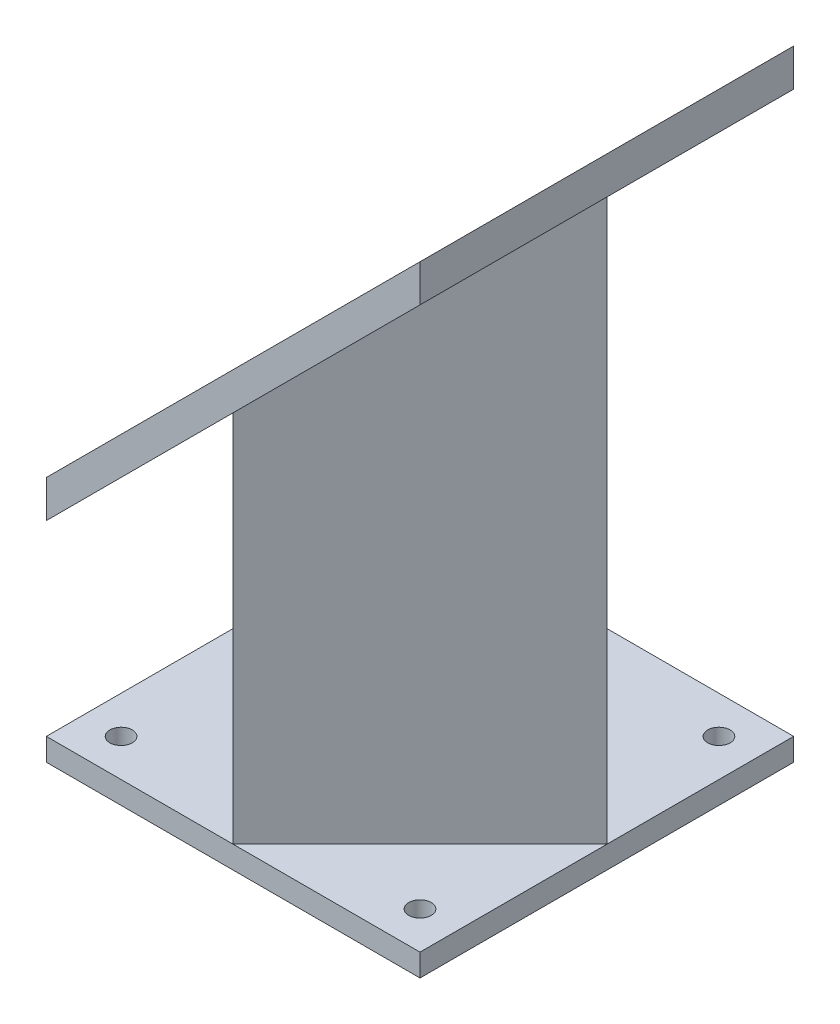
ISO-10303-21;
HEADER;
FILE_DESCRIPTION(('STEP AP214'),'2;1');
FILE_NAME('part.step','',(''),(''),'','','');
FILE_SCHEMA(('AUTOMOTIVE_DESIGN { 1 0 10303 214 1 1 1 1 }'));
ENDSEC;
DATA;
#1=APPLICATION_CONTEXT('core data for automotive mechanical design processes');
#2=APPLICATION_PROTOCOL_DEFINITION('international standard','automotive_design',2000,#1);
#3=PRODUCT_CONTEXT('',#1,'mechanical');
#4=PRODUCT('Part','Part','',(#3));
#5=PRODUCT_RELATED_PRODUCT_CATEGORY('part','',(#4));
#6=PRODUCT_DEFINITION_FORMATION('','',#4);
#7=PRODUCT_DEFINITION_CONTEXT('part definition',#1,'design');
#8=PRODUCT_DEFINITION('design','',#6,#7);
#9=PRODUCT_DEFINITION_SHAPE('','',#8);
#10=(LENGTH_UNIT() NAMED_UNIT(*) SI_UNIT(.MILLI.,.METRE.));
#11=(NAMED_UNIT(*) PLANE_ANGLE_UNIT() SI_UNIT($,.RADIAN.));
#12=(NAMED_UNIT(*) SI_UNIT($,.STERADIAN.) SOLID_ANGLE_UNIT());
#13=UNCERTAINTY_MEASURE_WITH_UNIT(LENGTH_MEASURE(1.E-05),#10,'distance_accuracy_value','');
#14=(GEOMETRIC_REPRESENTATION_CONTEXT(3) GLOBAL_UNCERTAINTY_ASSIGNED_CONTEXT((#13)) GLOBAL_UNIT_ASSIGNED_CONTEXT((#10,
#11,#12)) REPRESENTATION_CONTEXT('',''));
#15=CARTESIAN_POINT('',(0.,0.,0.));
#16=DIRECTION('',(0.,0.,1.));
#17=DIRECTION('',(1.,0.,0.));
#18=AXIS2_PLACEMENT_3D('',#15,#16,#17);
#19=CARTESIAN_POINT('',(0.,3.,0.));
#20=DIRECTION('',(0.,-1.,0.));
#21=DIRECTION('',(0.,0.,-1.));
#22=AXIS2_PLACEMENT_3D('',#19,#20,#21);
#23=PLANE('',#22);
#24=CARTESIAN_POINT('',(20.,3.,-20.));
#25=DIRECTION('',(0.,1.,0.));
#26=DIRECTION('',(0.,0.,1.));
#27=AXIS2_PLACEMENT_3D('',#24,#25,#26);
#28=CIRCLE('',#27,1.5);
#29=CARTESIAN_POINT('',(20.,3.,-18.5));
#30=VERTEX_POINT('',#29);
#31=EDGE_CURVE('E266',#30,#30,#28,.T.);
#32=ORIENTED_EDGE('',*,*,#31,.F.);
#33=EDGE_LOOP('',(#32));
#34=FACE_BOUND('',#33,.T.);
#35=DIRECTION('',(-0.707106781186547,0.,-0.707106781186547));
#36=VECTOR('',#35,1.);
#37=CARTESIAN_POINT('',(25.,3.,0.));
#38=LINE('',#37,#36);
#39=CARTESIAN_POINT('',(25.,3.,0.));
#40=VERTEX_POINT('',#39);
#41=CARTESIAN_POINT('',(0.,3.,-25.));
#42=VERTEX_POINT('',#41);
#43=EDGE_CURVE('E238',#40,#42,#38,.T.);
#44=ORIENTED_EDGE('',*,*,#43,.F.);
#45=DIRECTION('',(0.,0.,-1.));
#46=VECTOR('',#45,1.);
#47=CARTESIAN_POINT('',(25.,3.,25.));
#48=LINE('',#47,#46);
#49=CARTESIAN_POINT('',(25.,3.,-25.));
#50=VERTEX_POINT('',#49);
#51=EDGE_CURVE('E288',#40,#50,#48,.T.);
#52=ORIENTED_EDGE('',*,*,#51,.T.);
#53=DIRECTION('',(-1.,0.,0.));
#54=VECTOR('',#53,1.);
#55=CARTESIAN_POINT('',(-25.,3.,-25.));
#56=LINE('',#55,#54);
#57=EDGE_CURVE('E289',#50,#42,#56,.T.);
#58=ORIENTED_EDGE('',*,*,#57,.T.);
#59=EDGE_LOOP('',(#44,#52,#58));
#60=FACE_BOUND('',#59,.T.);
#61=ADVANCED_FACE('F37',(#34,#60),#23,.F.);
#62=CARTESIAN_POINT('',(20.,3.,20.));
#63=DIRECTION('',(0.,1.,0.));
#64=DIRECTION('',(0.,0.,1.));
#65=AXIS2_PLACEMENT_3D('',#62,#63,#64);
#66=CIRCLE('',#65,1.5);
#67=CARTESIAN_POINT('',(20.,3.,21.5));
#68=VERTEX_POINT('',#67);
#69=EDGE_CURVE('E260',#68,#68,#66,.T.);
#70=ORIENTED_EDGE('',*,*,#69,.F.);
#71=EDGE_LOOP('',(#70));
#72=FACE_BOUND('',#71,.T.);
#73=DIRECTION('',(0.707106781186547,0.,-0.707106781186547));
#74=VECTOR('',#73,1.);
#75=CARTESIAN_POINT('',(0.,3.,25.));
#76=LINE('',#75,#74);
#77=CARTESIAN_POINT('',(0.,3.,25.));
#78=VERTEX_POINT('',#77);
#79=EDGE_CURVE('E247',#78,#40,#76,.T.);
#80=ORIENTED_EDGE('',*,*,#79,.F.);
#81=DIRECTION('',(1.,0.,0.));
#82=VECTOR('',#81,1.);
#83=CARTESIAN_POINT('',(-25.,3.,25.));
#84=LINE('',#83,#82);
#85=CARTESIAN_POINT('',(25.,3.,25.));
#86=VERTEX_POINT('',#85);
#87=EDGE_CURVE('E296',#78,#86,#84,.T.);
#88=ORIENTED_EDGE('',*,*,#87,.T.);
#89=EDGE_CURVE('E284',#86,#40,#48,.T.);
#90=ORIENTED_EDGE('',*,*,#89,.T.);
#91=EDGE_LOOP('',(#80,#88,#90));
#92=FACE_BOUND('',#91,.T.);
#93=ADVANCED_FACE('F339',(#72,#92),#23,.F.);
#94=CARTESIAN_POINT('',(-20.,3.,20.));
#95=DIRECTION('',(0.,1.,0.));
#96=DIRECTION('',(0.,0.,1.));
#97=AXIS2_PLACEMENT_3D('',#94,#95,#96);
#98=CIRCLE('',#97,1.5);
#99=CARTESIAN_POINT('',(-20.,3.,21.5));
#100=VERTEX_POINT('',#99);
#101=EDGE_CURVE('E278',#100,#100,#98,.T.);
#102=ORIENTED_EDGE('',*,*,#101,.F.);
#103=EDGE_LOOP('',(#102));
#104=FACE_BOUND('',#103,.T.);
#105=DIRECTION('',(0.707106781186548,0.,0.707106781186547));
#106=VECTOR('',#105,1.);
#107=CARTESIAN_POINT('',(-25.,3.,0.));
#108=LINE('',#107,#106);
#109=CARTESIAN_POINT('',(-25.,3.,0.));
#110=VERTEX_POINT('',#109);
#111=EDGE_CURVE('E244',#110,#78,#108,.T.);
#112=ORIENTED_EDGE('',*,*,#111,.F.);
#113=DIRECTION('',(0.,0.,1.));
#114=VECTOR('',#113,1.);
#115=CARTESIAN_POINT('',(-25.,3.,25.));
#116=LINE('',#115,#114);
#117=CARTESIAN_POINT('',(-25.,3.,25.));
#118=VERTEX_POINT('',#117);
#119=EDGE_CURVE('E292',#110,#118,#116,.T.);
#120=ORIENTED_EDGE('',*,*,#119,.T.);
#121=EDGE_CURVE('E297',#118,#78,#84,.T.);
#122=ORIENTED_EDGE('',*,*,#121,.T.);
#123=EDGE_LOOP('',(#112,#120,#122));
#124=FACE_BOUND('',#123,.T.);
#125=ADVANCED_FACE('F372',(#104,#124),#23,.F.);
#126=CARTESIAN_POINT('',(-20.,3.,-20.));
#127=DIRECTION('',(0.,1.,0.));
#128=DIRECTION('',(0.,0.,1.));
#129=AXIS2_PLACEMENT_3D('',#126,#127,#128);
#130=CIRCLE('',#129,1.5);
#131=CARTESIAN_POINT('',(-20.,3.,-18.5));
#132=VERTEX_POINT('',#131);
#133=EDGE_CURVE('E272',#132,#132,#130,.T.);
#134=ORIENTED_EDGE('',*,*,#133,.F.);
#135=EDGE_LOOP('',(#134));
#136=FACE_BOUND('',#135,.T.);
#137=DIRECTION('',(-0.707106781186548,0.,0.707106781186547));
#138=VECTOR('',#137,1.);
#139=CARTESIAN_POINT('',(0.,3.,-25.));
#140=LINE('',#139,#138);
#141=EDGE_CURVE('E241',#42,#110,#140,.T.);
#142=ORIENTED_EDGE('',*,*,#141,.F.);
#143=CARTESIAN_POINT('',(-25.,3.,-25.));
#144=VERTEX_POINT('',#143);
#145=EDGE_CURVE('E287',#42,#144,#56,.T.);
#146=ORIENTED_EDGE('',*,*,#145,.T.);
#147=EDGE_CURVE('E293',#144,#110,#116,.T.);
#148=ORIENTED_EDGE('',*,*,#147,.T.);
#149=EDGE_LOOP('',(#142,#146,#148));
#150=FACE_BOUND('',#149,.T.);
#151=ADVANCED_FACE('F370',(#136,#150),#23,.F.);
#152=CARTESIAN_POINT('',(0.,0.,0.));
#153=DIRECTION('',(0.,-1.,0.));
#154=DIRECTION('',(0.,0.,-1.));
#155=AXIS2_PLACEMENT_3D('',#152,#153,#154);
#156=PLANE('',#155);
#157=CARTESIAN_POINT('',(20.,0.,-20.));
#158=DIRECTION('',(0.,1.,0.));
#159=DIRECTION('',(0.,0.,1.));
#160=AXIS2_PLACEMENT_3D('',#157,#158,#159);
#161=CIRCLE('',#160,1.5);
#162=CARTESIAN_POINT('',(20.,0.,-18.5));
#163=VERTEX_POINT('',#162);
#164=EDGE_CURVE('E263',#163,#163,#161,.T.);
#165=ORIENTED_EDGE('',*,*,#164,.T.);
#166=EDGE_LOOP('',(#165));
#167=FACE_BOUND('',#166,.T.);
#168=CARTESIAN_POINT('',(-20.,0.,20.));
#169=DIRECTION('',(0.,1.,0.));
#170=DIRECTION('',(0.,0.,1.));
#171=AXIS2_PLACEMENT_3D('',#168,#169,#170);
#172=CIRCLE('',#171,1.5);
#173=CARTESIAN_POINT('',(-20.,0.,21.5));
#174=VERTEX_POINT('',#173);
#175=EDGE_CURVE('E275',#174,#174,#172,.T.);
#176=ORIENTED_EDGE('',*,*,#175,.T.);
#177=EDGE_LOOP('',(#176));
#178=FACE_BOUND('',#177,.T.);
#179=DIRECTION('',(0.,0.,-1.));
#180=VECTOR('',#179,1.);
#181=CARTESIAN_POINT('',(25.,0.,25.));
#182=LINE('',#181,#180);
#183=CARTESIAN_POINT('',(25.,0.,25.));
#184=VERTEX_POINT('',#183);
#185=CARTESIAN_POINT('',(25.,0.,-25.));
#186=VERTEX_POINT('',#185);
#187=EDGE_CURVE('E281',#184,#186,#182,.T.);
#188=ORIENTED_EDGE('',*,*,#187,.F.);
#189=DIRECTION('',(1.,0.,0.));
#190=VECTOR('',#189,1.);
#191=CARTESIAN_POINT('',(-25.,0.,25.));
#192=LINE('',#191,#190);
#193=CARTESIAN_POINT('',(-25.,0.,25.));
#194=VERTEX_POINT('',#193);
#195=EDGE_CURVE('E307',#194,#184,#192,.T.);
#196=ORIENTED_EDGE('',*,*,#195,.F.);
#197=DIRECTION('',(0.,0.,1.));
#198=VECTOR('',#197,1.);
#199=CARTESIAN_POINT('',(-25.,0.,25.));
#200=LINE('',#199,#198);
#201=CARTESIAN_POINT('',(-25.,0.,-25.));
#202=VERTEX_POINT('',#201);
#203=EDGE_CURVE('E305',#202,#194,#200,.T.);
#204=ORIENTED_EDGE('',*,*,#203,.F.);
#205=DIRECTION('',(-1.,0.,0.));
#206=VECTOR('',#205,1.);
#207=CARTESIAN_POINT('',(-25.,0.,-25.));
#208=LINE('',#207,#206);
#209=EDGE_CURVE('E303',#186,#202,#208,.T.);
#210=ORIENTED_EDGE('',*,*,#209,.F.);
#211=EDGE_LOOP('',(#188,#196,#204,#210));
#212=FACE_BOUND('',#211,.T.);
#213=CARTESIAN_POINT('',(-20.,0.,-20.));
#214=DIRECTION('',(0.,1.,0.));
#215=DIRECTION('',(0.,0.,1.));
#216=AXIS2_PLACEMENT_3D('',#213,#214,#215);
#217=CIRCLE('',#216,1.5);
#218=CARTESIAN_POINT('',(-20.,0.,-18.5));
#219=VERTEX_POINT('',#218);
#220=EDGE_CURVE('E269',#219,#219,#217,.T.);
#221=ORIENTED_EDGE('',*,*,#220,.T.);
#222=EDGE_LOOP('',(#221));
#223=FACE_BOUND('',#222,.T.);
#224=CARTESIAN_POINT('',(20.,0.,20.));
#225=DIRECTION('',(0.,1.,0.));
#226=DIRECTION('',(0.,0.,1.));
#227=AXIS2_PLACEMENT_3D('',#224,#225,#226);
#228=CIRCLE('',#227,1.5);
#229=CARTESIAN_POINT('',(20.,0.,21.5));
#230=VERTEX_POINT('',#229);
#231=EDGE_CURVE('E259',#230,#230,#228,.T.);
#232=ORIENTED_EDGE('',*,*,#231,.T.);
#233=EDGE_LOOP('',(#232));
#234=FACE_BOUND('',#233,.T.);
#235=ADVANCED_FACE('F326',(#167,#178,#212,#223,#234),#156,.T.);
#236=CARTESIAN_POINT('',(25.,3.,25.));
#237=DIRECTION('',(-1.,0.,0.));
#238=DIRECTION('',(0.,0.,1.));
#239=AXIS2_PLACEMENT_3D('',#236,#237,#238);
#240=PLANE('',#239);
#241=ORIENTED_EDGE('',*,*,#187,.T.);
#242=DIRECTION('',(0.,-1.,0.));
#243=VECTOR('',#242,1.);
#244=CARTESIAN_POINT('',(25.,3.,-25.));
#245=LINE('',#244,#243);
#246=EDGE_CURVE('E11',#50,#186,#245,.T.);
#247=ORIENTED_EDGE('',*,*,#246,.F.);
#248=ORIENTED_EDGE('',*,*,#51,.F.);
#249=ORIENTED_EDGE('',*,*,#89,.F.);
#250=DIRECTION('',(0.,-1.,0.));
#251=VECTOR('',#250,1.);
#252=CARTESIAN_POINT('',(25.,3.,25.));
#253=LINE('',#252,#251);
#254=EDGE_CURVE('E300',#86,#184,#253,.T.);
#255=ORIENTED_EDGE('',*,*,#254,.T.);
#256=EDGE_LOOP('',(#241,#247,#248,#249,#255));
#257=FACE_BOUND('',#256,.T.);
#258=ADVANCED_FACE('F39',(#257),#240,.F.);
#259=CARTESIAN_POINT('',(-25.,3.,-25.));
#260=DIRECTION('',(0.,0.,1.));
#261=DIRECTION('',(1.,0.,0.));
#262=AXIS2_PLACEMENT_3D('',#259,#260,#261);
#263=PLANE('',#262);
#264=ORIENTED_EDGE('',*,*,#209,.T.);
#265=DIRECTION('',(0.,-1.,0.));
#266=VECTOR('',#265,1.);
#267=CARTESIAN_POINT('',(-25.,3.,-25.));
#268=LINE('',#267,#266);
#269=EDGE_CURVE('E45',#144,#202,#268,.T.);
#270=ORIENTED_EDGE('',*,*,#269,.F.);
#271=ORIENTED_EDGE('',*,*,#145,.F.);
#272=ORIENTED_EDGE('',*,*,#57,.F.);
#273=ORIENTED_EDGE('',*,*,#246,.T.);
#274=EDGE_LOOP('',(#264,#270,#271,#272,#273));
#275=FACE_BOUND('',#274,.T.);
#276=ADVANCED_FACE('F451',(#275),#263,.F.);
#277=CARTESIAN_POINT('',(-25.,3.,25.));
#278=DIRECTION('',(1.,0.,0.));
#279=DIRECTION('',(0.,0.,-1.));
#280=AXIS2_PLACEMENT_3D('',#277,#278,#279);
#281=PLANE('',#280);
#282=ORIENTED_EDGE('',*,*,#203,.T.);
#283=DIRECTION('',(0.,-1.,0.));
#284=VECTOR('',#283,1.);
#285=CARTESIAN_POINT('',(-25.,3.,25.));
#286=LINE('',#285,#284);
#287=EDGE_CURVE('E311',#118,#194,#286,.T.);
#288=ORIENTED_EDGE('',*,*,#287,.F.);
#289=ORIENTED_EDGE('',*,*,#119,.F.);
#290=ORIENTED_EDGE('',*,*,#147,.F.);
#291=ORIENTED_EDGE('',*,*,#269,.T.);
#292=EDGE_LOOP('',(#282,#288,#289,#290,#291));
#293=FACE_BOUND('',#292,.T.);
#294=ADVANCED_FACE('F318',(#293),#281,.F.);
#295=CARTESIAN_POINT('',(-25.,3.,25.));
#296=DIRECTION('',(0.,0.,-1.));
#297=DIRECTION('',(-1.,0.,0.));
#298=AXIS2_PLACEMENT_3D('',#295,#296,#297);
#299=PLANE('',#298);
#300=ORIENTED_EDGE('',*,*,#195,.T.);
#301=ORIENTED_EDGE('',*,*,#254,.F.);
#302=ORIENTED_EDGE('',*,*,#87,.F.);
#303=ORIENTED_EDGE('',*,*,#121,.F.);
#304=ORIENTED_EDGE('',*,*,#287,.T.);
#305=EDGE_LOOP('',(#300,#301,#302,#303,#304));
#306=FACE_BOUND('',#305,.T.);
#307=ADVANCED_FACE('F330',(#306),#299,.F.);
#308=CARTESIAN_POINT('',(-20.,3.,20.));
#309=DIRECTION('',(0.,-1.,0.));
#310=DIRECTION('',(0.,0.,-1.));
#311=AXIS2_PLACEMENT_3D('',#308,#309,#310);
#312=CYLINDRICAL_SURFACE('',#311,1.5);
#313=ORIENTED_EDGE('',*,*,#101,.T.);
#314=EDGE_LOOP('',(#313));
#315=FACE_BOUND('',#314,.T.);
#316=ORIENTED_EDGE('',*,*,#175,.F.);
#317=EDGE_LOOP('',(#316));
#318=FACE_BOUND('',#317,.T.);
#319=ADVANCED_FACE('F435',(#315,#318),#312,.F.);
#320=CARTESIAN_POINT('',(-20.,3.,-20.));
#321=DIRECTION('',(0.,-1.,0.));
#322=DIRECTION('',(0.,0.,-1.));
#323=AXIS2_PLACEMENT_3D('',#320,#321,#322);
#324=CYLINDRICAL_SURFACE('',#323,1.5);
#325=ORIENTED_EDGE('',*,*,#133,.T.);
#326=EDGE_LOOP('',(#325));
#327=FACE_BOUND('',#326,.T.);
#328=ORIENTED_EDGE('',*,*,#220,.F.);
#329=EDGE_LOOP('',(#328));
#330=FACE_BOUND('',#329,.T.);
#331=ADVANCED_FACE('F432',(#327,#330),#324,.F.);
#332=CARTESIAN_POINT('',(20.,3.,-20.));
#333=DIRECTION('',(0.,-1.,0.));
#334=DIRECTION('',(0.,0.,-1.));
#335=AXIS2_PLACEMENT_3D('',#332,#333,#334);
#336=CYLINDRICAL_SURFACE('',#335,1.5);
#337=ORIENTED_EDGE('',*,*,#31,.T.);
#338=EDGE_LOOP('',(#337));
#339=FACE_BOUND('',#338,.T.);
#340=ORIENTED_EDGE('',*,*,#164,.F.);
#341=EDGE_LOOP('',(#340));
#342=FACE_BOUND('',#341,.T.);
#343=ADVANCED_FACE('F428',(#339,#342),#336,.F.);
#344=CARTESIAN_POINT('',(20.,3.,20.));
#345=DIRECTION('',(0.,-1.,0.));
#346=DIRECTION('',(0.,0.,-1.));
#347=AXIS2_PLACEMENT_3D('',#344,#345,#346);
#348=CYLINDRICAL_SURFACE('',#347,1.5);
#349=ORIENTED_EDGE('',*,*,#69,.T.);
#350=EDGE_LOOP('',(#349));
#351=FACE_BOUND('',#350,.T.);
#352=ORIENTED_EDGE('',*,*,#231,.F.);
#353=EDGE_LOOP('',(#352));
#354=FACE_BOUND('',#353,.T.);
#355=ADVANCED_FACE('F425',(#351,#354),#348,.F.);
#356=CARTESIAN_POINT('',(25.,78.,0.));
#357=DIRECTION('',(-0.707106781186548,0.,0.707106781186548));
#358=DIRECTION('',(0.707106781186548,0.,0.707106781186548));
#359=AXIS2_PLACEMENT_3D('',#356,#357,#358);
#360=PLANE('',#359);
#361=DIRECTION('',(0.,-1.,0.));
#362=VECTOR('',#361,1.);
#363=CARTESIAN_POINT('',(0.,78.,-25.));
#364=LINE('',#363,#362);
#365=CARTESIAN_POINT('',(0.,53.0000000000002,-25.));
#366=VERTEX_POINT('',#365);
#367=EDGE_CURVE('E257',#366,#42,#364,.T.);
#368=ORIENTED_EDGE('',*,*,#367,.F.);
#369=DIRECTION('',(0.577350269189628,0.577350269189622,0.577350269189628));
#370=VECTOR('',#369,1.);
#371=CARTESIAN_POINT('',(25.,78.,0.));
#372=LINE('',#371,#370);
#373=CARTESIAN_POINT('',(25.,78.,0.));
#374=VERTEX_POINT('',#373);
#375=EDGE_CURVE('E223',#366,#374,#372,.T.);
#376=ORIENTED_EDGE('',*,*,#375,.T.);
#377=DIRECTION('',(0.,-1.,0.));
#378=VECTOR('',#377,1.);
#379=CARTESIAN_POINT('',(25.,78.,0.));
#380=LINE('',#379,#378);
#381=EDGE_CURVE('E250',#374,#40,#380,.T.);
#382=ORIENTED_EDGE('',*,*,#381,.T.);
#383=ORIENTED_EDGE('',*,*,#43,.T.);
#384=EDGE_LOOP('',(#368,#376,#382,#383));
#385=FACE_BOUND('',#384,.T.);
#386=ADVANCED_FACE('F346',(#385),#360,.F.);
#387=CARTESIAN_POINT('',(0.,78.,-25.));
#388=DIRECTION('',(0.707106781186547,0.,0.707106781186548));
#389=DIRECTION('',(0.707106781186548,0.,-0.707106781186547));
#390=AXIS2_PLACEMENT_3D('',#387,#388,#389);
#391=PLANE('',#390);
#392=DIRECTION('',(0.,-1.,0.));
#393=VECTOR('',#392,1.);
#394=CARTESIAN_POINT('',(-25.,78.,0.));
#395=LINE('',#394,#393);
#396=CARTESIAN_POINT('',(-25.,28.0000000000005,0.));
#397=VERTEX_POINT('',#396);
#398=EDGE_CURVE('E255',#397,#110,#395,.T.);
#399=ORIENTED_EDGE('',*,*,#398,.F.);
#400=DIRECTION('',(0.577350269189628,0.577350269189622,-0.577350269189628));
#401=VECTOR('',#400,1.);
#402=CARTESIAN_POINT('',(8.33333333333322,61.3333333333334,-33.3333333333332));
#403=LINE('',#402,#401);
#404=EDGE_CURVE('E220',#397,#366,#403,.T.);
#405=ORIENTED_EDGE('',*,*,#404,.T.);
#406=ORIENTED_EDGE('',*,*,#367,.T.);
#407=ORIENTED_EDGE('',*,*,#141,.T.);
#408=EDGE_LOOP('',(#399,#405,#406,#407));
#409=FACE_BOUND('',#408,.T.);
#410=ADVANCED_FACE('F363',(#409),#391,.F.);
#411=CARTESIAN_POINT('',(-25.,78.,0.));
#412=DIRECTION('',(0.707106781186547,0.,-0.707106781186548));
#413=DIRECTION('',(-0.707106781186548,0.,-0.707106781186547));
#414=AXIS2_PLACEMENT_3D('',#411,#412,#413);
#415=PLANE('',#414);
#416=DIRECTION('',(0.,-1.,0.));
#417=VECTOR('',#416,1.);
#418=CARTESIAN_POINT('',(0.,78.,25.));
#419=LINE('',#418,#417);
#420=CARTESIAN_POINT('',(0.,53.0000000000003,25.));
#421=VERTEX_POINT('',#420);
#422=EDGE_CURVE('E253',#421,#78,#419,.T.);
#423=ORIENTED_EDGE('',*,*,#422,.F.);
#424=DIRECTION('',(-0.577350269189628,-0.577350269189622,-0.577350269189628));
#425=VECTOR('',#424,1.);
#426=CARTESIAN_POINT('',(-8.33333333333356,44.6666666666668,16.6666666666664));
#427=LINE('',#426,#425);
#428=EDGE_CURVE('E217',#421,#397,#427,.T.);
#429=ORIENTED_EDGE('',*,*,#428,.T.);
#430=ORIENTED_EDGE('',*,*,#398,.T.);
#431=ORIENTED_EDGE('',*,*,#111,.T.);
#432=EDGE_LOOP('',(#423,#429,#430,#431));
#433=FACE_BOUND('',#432,.T.);
#434=ADVANCED_FACE('F366',(#433),#415,.F.);
#435=CARTESIAN_POINT('',(0.,78.,25.));
#436=DIRECTION('',(-0.707106781186548,0.,-0.707106781186548));
#437=DIRECTION('',(-0.707106781186548,0.,0.707106781186548));
#438=AXIS2_PLACEMENT_3D('',#435,#436,#437);
#439=PLANE('',#438);
#440=ORIENTED_EDGE('',*,*,#381,.F.);
#441=DIRECTION('',(-0.577350269189628,-0.577350269189622,0.577350269189628));
#442=VECTOR('',#441,1.);
#443=CARTESIAN_POINT('',(8.33333333333322,61.3333333333334,16.6666666666668));
#444=LINE('',#443,#442);
#445=EDGE_CURVE('E214',#374,#421,#444,.T.);
#446=ORIENTED_EDGE('',*,*,#445,.T.);
#447=ORIENTED_EDGE('',*,*,#422,.T.);
#448=ORIENTED_EDGE('',*,*,#79,.T.);
#449=EDGE_LOOP('',(#440,#446,#447,#448));
#450=FACE_BOUND('',#449,.T.);
#451=ADVANCED_FACE('F342',(#450),#439,.F.);
#452=CARTESIAN_POINT('',(-26.5000000000001,26.5000000000004,0.));
#453=DIRECTION('',(0.707106781186544,-0.707106781186551,0.));
#454=DIRECTION('',(0.707106781186551,0.707106781186544,0.));
#455=AXIS2_PLACEMENT_3D('',#452,#453,#454);
#456=PLANE('',#455);
#457=ORIENTED_EDGE('',*,*,#375,.F.);
#458=DIRECTION('',(-0.707106781186551,-0.707106781186544,0.));
#459=VECTOR('',#458,1.);
#460=CARTESIAN_POINT('',(-25.,28.0000000000005,-25.));
#461=LINE('',#460,#459);
#462=CARTESIAN_POINT('',(25.,78.,-25.));
#463=VERTEX_POINT('',#462);
#464=EDGE_CURVE('E198',#463,#366,#461,.T.);
#465=ORIENTED_EDGE('',*,*,#464,.F.);
#466=DIRECTION('',(0.,0.,-1.));
#467=VECTOR('',#466,1.);
#468=CARTESIAN_POINT('',(25.,78.,-25.));
#469=LINE('',#468,#467);
#470=EDGE_CURVE('E193',#374,#463,#469,.T.);
#471=ORIENTED_EDGE('',*,*,#470,.F.);
#472=EDGE_LOOP('',(#457,#465,#471));
#473=FACE_BOUND('',#472,.T.);
#474=ADVANCED_FACE('F351',(#473),#456,.T.);
#475=ORIENTED_EDGE('',*,*,#404,.F.);
#476=DIRECTION('',(0.,0.,1.));
#477=VECTOR('',#476,1.);
#478=CARTESIAN_POINT('',(-25.,28.0000000000005,-25.));
#479=LINE('',#478,#477);
#480=CARTESIAN_POINT('',(-25.,28.0000000000005,-25.));
#481=VERTEX_POINT('',#480);
#482=EDGE_CURVE('E185',#481,#397,#479,.T.);
#483=ORIENTED_EDGE('',*,*,#482,.F.);
#484=EDGE_CURVE('E197',#366,#481,#461,.T.);
#485=ORIENTED_EDGE('',*,*,#484,.F.);
#486=EDGE_LOOP('',(#475,#483,#485));
#487=FACE_BOUND('',#486,.T.);
#488=ADVANCED_FACE('F354',(#487),#456,.T.);
#489=ORIENTED_EDGE('',*,*,#428,.F.);
#490=DIRECTION('',(0.707106781186551,0.707106781186544,0.));
#491=VECTOR('',#490,1.);
#492=CARTESIAN_POINT('',(-25.,28.0000000000005,25.));
#493=LINE('',#492,#491);
#494=CARTESIAN_POINT('',(-25.,28.0000000000005,25.));
#495=VERTEX_POINT('',#494);
#496=EDGE_CURVE('E52',#495,#421,#493,.T.);
#497=ORIENTED_EDGE('',*,*,#496,.F.);
#498=EDGE_CURVE('E201',#397,#495,#479,.T.);
#499=ORIENTED_EDGE('',*,*,#498,.F.);
#500=EDGE_LOOP('',(#489,#497,#499));
#501=FACE_BOUND('',#500,.T.);
#502=ADVANCED_FACE('F526',(#501),#456,.T.);
#503=ORIENTED_EDGE('',*,*,#445,.F.);
#504=CARTESIAN_POINT('',(25.,78.,25.));
#505=VERTEX_POINT('',#504);
#506=EDGE_CURVE('E194',#505,#374,#469,.T.);
#507=ORIENTED_EDGE('',*,*,#506,.F.);
#508=EDGE_CURVE('E180',#421,#505,#493,.T.);
#509=ORIENTED_EDGE('',*,*,#508,.F.);
#510=EDGE_LOOP('',(#503,#507,#509));
#511=FACE_BOUND('',#510,.T.);
#512=ADVANCED_FACE('F516',(#511),#456,.T.);
#513=CARTESIAN_POINT('',(-26.5000000000001,31.5000000000004,0.));
#514=DIRECTION('',(0.707106781186544,-0.707106781186551,0.));
#515=DIRECTION('',(0.707106781186551,0.707106781186544,0.));
#516=AXIS2_PLACEMENT_3D('',#513,#514,#515);
#517=PLANE('',#516);
#518=DIRECTION('',(0.707106781186551,0.707106781186544,0.));
#519=VECTOR('',#518,1.);
#520=CARTESIAN_POINT('',(-25.,33.0000000000005,25.));
#521=LINE('',#520,#519);
#522=CARTESIAN_POINT('',(-25.,33.0000000000005,25.));
#523=VERTEX_POINT('',#522);
#524=CARTESIAN_POINT('',(25.,83.,25.));
#525=VERTEX_POINT('',#524);
#526=EDGE_CURVE('E181',#523,#525,#521,.T.);
#527=ORIENTED_EDGE('',*,*,#526,.T.);
#528=DIRECTION('',(0.,0.,-1.));
#529=VECTOR('',#528,1.);
#530=CARTESIAN_POINT('',(25.,83.,-25.));
#531=LINE('',#530,#529);
#532=CARTESIAN_POINT('',(25.,83.,-25.));
#533=VERTEX_POINT('',#532);
#534=EDGE_CURVE('E184',#525,#533,#531,.T.);
#535=ORIENTED_EDGE('',*,*,#534,.T.);
#536=DIRECTION('',(-0.707106781186551,-0.707106781186544,0.));
#537=VECTOR('',#536,1.);
#538=CARTESIAN_POINT('',(-25.,33.0000000000005,-25.));
#539=LINE('',#538,#537);
#540=CARTESIAN_POINT('',(-25.,33.0000000000005,-25.));
#541=VERTEX_POINT('',#540);
#542=EDGE_CURVE('E187',#533,#541,#539,.T.);
#543=ORIENTED_EDGE('',*,*,#542,.T.);
#544=DIRECTION('',(0.,0.,1.));
#545=VECTOR('',#544,1.);
#546=CARTESIAN_POINT('',(-25.,33.0000000000005,-25.));
#547=LINE('',#546,#545);
#548=EDGE_CURVE('E189',#541,#523,#547,.T.);
#549=ORIENTED_EDGE('',*,*,#548,.T.);
#550=EDGE_LOOP('',(#527,#535,#543,#549));
#551=FACE_BOUND('',#550,.T.);
#552=DIRECTION('',(-0.577350269189628,-0.577350269189622,0.577350269189628));
#553=VECTOR('',#552,1.);
#554=CARTESIAN_POINT('',(-17.9289321881345,40.0710678118659,0.));
#555=LINE('',#554,#553);
#556=CARTESIAN_POINT('',(0.,58.0000000000002,-17.9289321881345));
#557=VERTEX_POINT('',#556);
#558=CARTESIAN_POINT('',(-17.9289321881345,40.0710678118659,0.));
#559=VERTEX_POINT('',#558);
#560=EDGE_CURVE('E167',#557,#559,#555,.T.);
#561=ORIENTED_EDGE('',*,*,#560,.F.);
#562=DIRECTION('',(-0.577350269189628,-0.577350269189622,-0.577350269189628));
#563=VECTOR('',#562,1.);
#564=CARTESIAN_POINT('',(0.,58.0000000000002,-17.9289321881345));
#565=LINE('',#564,#563);
#566=CARTESIAN_POINT('',(17.9289321881345,75.9289321881346,0.));
#567=VERTEX_POINT('',#566);
#568=EDGE_CURVE('E176',#567,#557,#565,.T.);
#569=ORIENTED_EDGE('',*,*,#568,.F.);
#570=DIRECTION('',(0.577350269189628,0.577350269189622,-0.577350269189628));
#571=VECTOR('',#570,1.);
#572=CARTESIAN_POINT('',(17.9289321881345,75.9289321881346,0.));
#573=LINE('',#572,#571);
#574=CARTESIAN_POINT('',(0.,58.0000000000003,17.9289321881345));
#575=VERTEX_POINT('',#574);
#576=EDGE_CURVE('E174',#575,#567,#573,.T.);
#577=ORIENTED_EDGE('',*,*,#576,.F.);
#578=DIRECTION('',(0.577350269189628,0.577350269189622,0.577350269189628));
#579=VECTOR('',#578,1.);
#580=CARTESIAN_POINT('',(0.,58.0000000000003,17.9289321881345));
#581=LINE('',#580,#579);
#582=EDGE_CURVE('E156',#559,#575,#581,.T.);
#583=ORIENTED_EDGE('',*,*,#582,.F.);
#584=EDGE_LOOP('',(#561,#569,#577,#583));
#585=FACE_BOUND('',#584,.T.);
#586=ADVANCED_FACE('F173',(#551,#585),#517,.F.);
#587=CARTESIAN_POINT('',(-25.,33.0000000000005,25.));
#588=DIRECTION('',(0.,0.,-1.));
#589=DIRECTION('',(-1.,0.,0.));
#590=AXIS2_PLACEMENT_3D('',#587,#588,#589);
#591=PLANE('',#590);
#592=ORIENTED_EDGE('',*,*,#496,.T.);
#593=ORIENTED_EDGE('',*,*,#508,.T.);
#594=DIRECTION('',(0.,-1.,0.));
#595=VECTOR('',#594,1.);
#596=CARTESIAN_POINT('',(25.,83.,25.));
#597=LINE('',#596,#595);
#598=EDGE_CURVE('E211',#525,#505,#597,.T.);
#599=ORIENTED_EDGE('',*,*,#598,.F.);
#600=ORIENTED_EDGE('',*,*,#526,.F.);
#601=DIRECTION('',(0.,-1.,0.));
#602=VECTOR('',#601,1.);
#603=CARTESIAN_POINT('',(-25.,33.0000000000005,25.));
#604=LINE('',#603,#602);
#605=EDGE_CURVE('E191',#523,#495,#604,.T.);
#606=ORIENTED_EDGE('',*,*,#605,.T.);
#607=EDGE_LOOP('',(#592,#593,#599,#600,#606));
#608=FACE_BOUND('',#607,.T.);
#609=ADVANCED_FACE('F412',(#608),#591,.F.);
#610=CARTESIAN_POINT('',(25.,83.,-25.));
#611=DIRECTION('',(-1.,0.,0.));
#612=DIRECTION('',(0.,0.,1.));
#613=AXIS2_PLACEMENT_3D('',#610,#611,#612);
#614=PLANE('',#613);
#615=ORIENTED_EDGE('',*,*,#506,.T.);
#616=ORIENTED_EDGE('',*,*,#470,.T.);
#617=DIRECTION('',(0.,-1.,0.));
#618=VECTOR('',#617,1.);
#619=CARTESIAN_POINT('',(25.,83.,-25.));
#620=LINE('',#619,#618);
#621=EDGE_CURVE('E208',#533,#463,#620,.T.);
#622=ORIENTED_EDGE('',*,*,#621,.F.);
#623=ORIENTED_EDGE('',*,*,#534,.F.);
#624=ORIENTED_EDGE('',*,*,#598,.T.);
#625=EDGE_LOOP('',(#615,#616,#622,#623,#624));
#626=FACE_BOUND('',#625,.T.);
#627=ADVANCED_FACE('F563',(#626),#614,.F.);
#628=CARTESIAN_POINT('',(-25.,33.0000000000005,-25.));
#629=DIRECTION('',(0.,0.,1.));
#630=DIRECTION('',(1.,0.,0.));
#631=AXIS2_PLACEMENT_3D('',#628,#629,#630);
#632=PLANE('',#631);
#633=ORIENTED_EDGE('',*,*,#464,.T.);
#634=ORIENTED_EDGE('',*,*,#484,.T.);
#635=DIRECTION('',(0.,-1.,0.));
#636=VECTOR('',#635,1.);
#637=CARTESIAN_POINT('',(-25.,33.0000000000005,-25.));
#638=LINE('',#637,#636);
#639=EDGE_CURVE('E205',#541,#481,#638,.T.);
#640=ORIENTED_EDGE('',*,*,#639,.F.);
#641=ORIENTED_EDGE('',*,*,#542,.F.);
#642=ORIENTED_EDGE('',*,*,#621,.T.);
#643=EDGE_LOOP('',(#633,#634,#640,#641,#642));
#644=FACE_BOUND('',#643,.T.);
#645=ADVANCED_FACE('F358',(#644),#632,.F.);
#646=CARTESIAN_POINT('',(-25.,33.0000000000005,-25.));
#647=DIRECTION('',(1.,0.,0.));
#648=DIRECTION('',(0.,0.,-1.));
#649=AXIS2_PLACEMENT_3D('',#646,#647,#648);
#650=PLANE('',#649);
#651=ORIENTED_EDGE('',*,*,#482,.T.);
#652=ORIENTED_EDGE('',*,*,#498,.T.);
#653=ORIENTED_EDGE('',*,*,#605,.F.);
#654=ORIENTED_EDGE('',*,*,#548,.F.);
#655=ORIENTED_EDGE('',*,*,#639,.T.);
#656=EDGE_LOOP('',(#651,#652,#653,#654,#655));
#657=FACE_BOUND('',#656,.T.);
#658=ADVANCED_FACE('F394',(#657),#650,.F.);
#659=DIRECTION('',(0.707106781186548,0.,-0.707106781186548));
#660=VECTOR('',#659,1.);
#661=CARTESIAN_POINT('',(0.,3.,17.9289321881345));
#662=LINE('',#661,#660);
#663=CARTESIAN_POINT('',(0.,3.,17.9289321881345));
#664=VERTEX_POINT('',#663);
#665=CARTESIAN_POINT('',(17.9289321881345,3.,0.));
#666=VERTEX_POINT('',#665);
#667=EDGE_CURVE('E232',#664,#666,#662,.T.);
#668=ORIENTED_EDGE('',*,*,#667,.T.);
#669=DIRECTION('',(-0.707106781186548,0.,-0.707106781186548));
#670=VECTOR('',#669,1.);
#671=CARTESIAN_POINT('',(17.9289321881345,3.,0.));
#672=LINE('',#671,#670);
#673=CARTESIAN_POINT('',(0.,3.,-17.9289321881345));
#674=VERTEX_POINT('',#673);
#675=EDGE_CURVE('E226',#666,#674,#672,.T.);
#676=ORIENTED_EDGE('',*,*,#675,.T.);
#677=DIRECTION('',(-0.707106781186547,0.,0.707106781186548));
#678=VECTOR('',#677,1.);
#679=CARTESIAN_POINT('',(0.,3.,-17.9289321881345));
#680=LINE('',#679,#678);
#681=CARTESIAN_POINT('',(-17.9289321881345,3.,0.));
#682=VERTEX_POINT('',#681);
#683=EDGE_CURVE('E229',#674,#682,#680,.T.);
#684=ORIENTED_EDGE('',*,*,#683,.T.);
#685=DIRECTION('',(0.707106781186548,0.,0.707106781186547));
#686=VECTOR('',#685,1.);
#687=CARTESIAN_POINT('',(-17.9289321881345,3.,0.));
#688=LINE('',#687,#686);
#689=EDGE_CURVE('E159',#682,#664,#688,.T.);
#690=ORIENTED_EDGE('',*,*,#689,.T.);
#691=EDGE_LOOP('',(#668,#676,#684,#690));
#692=FACE_BOUND('',#691,.T.);
#693=ADVANCED_FACE('F381',(#692),#23,.F.);
#694=CARTESIAN_POINT('',(17.9289321881345,78.,0.));
#695=DIRECTION('',(-0.707106781186547,0.,0.707106781186548));
#696=DIRECTION('',(0.707106781186548,0.,0.707106781186547));
#697=AXIS2_PLACEMENT_3D('',#694,#695,#696);
#698=PLANE('',#697);
#699=DIRECTION('',(0.,-1.,0.));
#700=VECTOR('',#699,1.);
#701=CARTESIAN_POINT('',(17.9289321881345,78.,0.));
#702=LINE('',#701,#700);
#703=EDGE_CURVE('E60',#567,#666,#702,.T.);
#704=ORIENTED_EDGE('',*,*,#703,.F.);
#705=ORIENTED_EDGE('',*,*,#568,.T.);
#706=DIRECTION('',(0.,-1.,0.));
#707=VECTOR('',#706,1.);
#708=CARTESIAN_POINT('',(0.,78.,-17.9289321881345));
#709=LINE('',#708,#707);
#710=EDGE_CURVE('E163',#557,#674,#709,.T.);
#711=ORIENTED_EDGE('',*,*,#710,.T.);
#712=ORIENTED_EDGE('',*,*,#675,.F.);
#713=EDGE_LOOP('',(#704,#705,#711,#712));
#714=FACE_BOUND('',#713,.T.);
#715=ADVANCED_FACE('F393',(#714),#698,.T.);
#716=CARTESIAN_POINT('',(0.,78.,-17.9289321881345));
#717=DIRECTION('',(0.707106781186548,0.,0.707106781186547));
#718=DIRECTION('',(0.707106781186547,0.,-0.707106781186548));
#719=AXIS2_PLACEMENT_3D('',#716,#717,#718);
#720=PLANE('',#719);
#721=ORIENTED_EDGE('',*,*,#710,.F.);
#722=ORIENTED_EDGE('',*,*,#560,.T.);
#723=DIRECTION('',(0.,-1.,0.));
#724=VECTOR('',#723,1.);
#725=CARTESIAN_POINT('',(-17.9289321881345,78.,0.));
#726=LINE('',#725,#724);
#727=EDGE_CURVE('E152',#559,#682,#726,.T.);
#728=ORIENTED_EDGE('',*,*,#727,.T.);
#729=ORIENTED_EDGE('',*,*,#683,.F.);
#730=EDGE_LOOP('',(#721,#722,#728,#729));
#731=FACE_BOUND('',#730,.T.);
#732=ADVANCED_FACE('F168',(#731),#720,.T.);
#733=CARTESIAN_POINT('',(-17.9289321881345,78.,0.));
#734=DIRECTION('',(0.707106781186547,0.,-0.707106781186548));
#735=DIRECTION('',(-0.707106781186548,0.,-0.707106781186547));
#736=AXIS2_PLACEMENT_3D('',#733,#734,#735);
#737=PLANE('',#736);
#738=ORIENTED_EDGE('',*,*,#727,.F.);
#739=ORIENTED_EDGE('',*,*,#582,.T.);
#740=DIRECTION('',(0.,-1.,0.));
#741=VECTOR('',#740,1.);
#742=CARTESIAN_POINT('',(0.,78.,17.9289321881345));
#743=LINE('',#742,#741);
#744=EDGE_CURVE('E164',#575,#664,#743,.T.);
#745=ORIENTED_EDGE('',*,*,#744,.T.);
#746=ORIENTED_EDGE('',*,*,#689,.F.);
#747=EDGE_LOOP('',(#738,#739,#745,#746));
#748=FACE_BOUND('',#747,.T.);
#749=ADVANCED_FACE('F154',(#748),#737,.T.);
#750=CARTESIAN_POINT('',(0.,78.,17.9289321881345));
#751=DIRECTION('',(-0.707106781186548,0.,-0.707106781186548));
#752=DIRECTION('',(-0.707106781186548,0.,0.707106781186548));
#753=AXIS2_PLACEMENT_3D('',#750,#751,#752);
#754=PLANE('',#753);
#755=ORIENTED_EDGE('',*,*,#744,.F.);
#756=ORIENTED_EDGE('',*,*,#576,.T.);
#757=ORIENTED_EDGE('',*,*,#703,.T.);
#758=ORIENTED_EDGE('',*,*,#667,.F.);
#759=EDGE_LOOP('',(#755,#756,#757,#758));
#760=FACE_BOUND('',#759,.T.);
#761=ADVANCED_FACE('F404',(#760),#754,.T.);
#762=CLOSED_SHELL('',(#61,#93,#125,#151,#235,#258,#276,#294,#307,#319,#331,#343,#355,#386,#410,
#434,#451,#474,#488,#502,#512,#586,#609,#627,#645,#658,#693,#715,#732,#749,#761));
#763=MANIFOLD_SOLID_BREP('B2',#762);
#764=ADVANCED_BREP_SHAPE_REPRESENTATION('',(#18,#763),#14);
#765=SHAPE_DEFINITION_REPRESENTATION(#9,#764);
ENDSEC;
END-ISO-10303-21;
